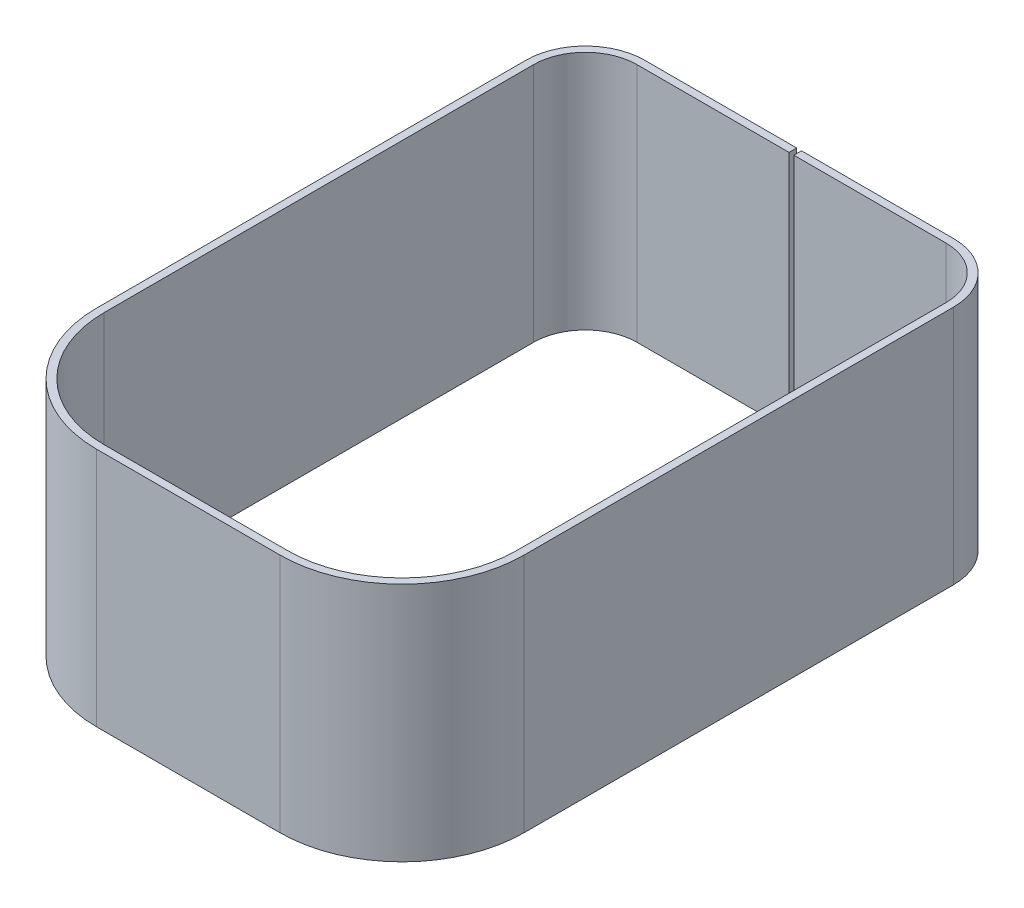
ISO-10303-21;
HEADER;
FILE_DESCRIPTION(('STEP AP214'),'2;1');
FILE_NAME('part.step','',(''),(''),'','','');
FILE_SCHEMA(('AUTOMOTIVE_DESIGN { 1 0 10303 214 1 1 1 1 }'));
ENDSEC;
DATA;
#1=APPLICATION_CONTEXT('core data for automotive mechanical design processes');
#2=APPLICATION_PROTOCOL_DEFINITION('international standard','automotive_design',2000,#1);
#3=PRODUCT_CONTEXT('',#1,'mechanical');
#4=PRODUCT('Part','Part','',(#3));
#5=PRODUCT_RELATED_PRODUCT_CATEGORY('part','',(#4));
#6=PRODUCT_DEFINITION_FORMATION('','',#4);
#7=PRODUCT_DEFINITION_CONTEXT('part definition',#1,'design');
#8=PRODUCT_DEFINITION('design','',#6,#7);
#9=PRODUCT_DEFINITION_SHAPE('','',#8);
#10=(LENGTH_UNIT() NAMED_UNIT(*) SI_UNIT(.MILLI.,.METRE.));
#11=(NAMED_UNIT(*) PLANE_ANGLE_UNIT() SI_UNIT($,.RADIAN.));
#12=(NAMED_UNIT(*) SI_UNIT($,.STERADIAN.) SOLID_ANGLE_UNIT());
#13=UNCERTAINTY_MEASURE_WITH_UNIT(LENGTH_MEASURE(1.E-05),#10,'distance_accuracy_value','');
#14=(GEOMETRIC_REPRESENTATION_CONTEXT(3) GLOBAL_UNCERTAINTY_ASSIGNED_CONTEXT((#13)) GLOBAL_UNIT_ASSIGNED_CONTEXT((#10,
#11,#12)) REPRESENTATION_CONTEXT('',''));
#15=CARTESIAN_POINT('',(0.,0.,0.));
#16=DIRECTION('',(0.,0.,1.));
#17=DIRECTION('',(1.,0.,0.));
#18=AXIS2_PLACEMENT_3D('',#15,#16,#17);
#19=CARTESIAN_POINT('',(32.1126094796714,30.,-61.9125));
#20=DIRECTION('',(0.,0.,-1.));
#21=DIRECTION('',(-1.,0.,0.));
#22=AXIS2_PLACEMENT_3D('',#19,#20,#21);
#23=PLANE('',#22);
#24=DIRECTION('',(0.,1.,0.));
#25=VECTOR('',#24,1.);
#26=CARTESIAN_POINT('',(0.5,30.,-61.9125));
#27=LINE('',#26,#25);
#28=CARTESIAN_POINT('',(0.5,-20.,-61.9125));
#29=VERTEX_POINT('',#28);
#30=CARTESIAN_POINT('',(0.5,30.,-61.9125));
#31=VERTEX_POINT('',#30);
#32=EDGE_CURVE('E11',#29,#31,#27,.T.);
#33=ORIENTED_EDGE('',*,*,#32,.F.);
#34=DIRECTION('',(1.,0.,0.));
#35=VECTOR('',#34,1.);
#36=CARTESIAN_POINT('',(32.1126094796714,-20.,-61.9125));
#37=LINE('',#36,#35);
#38=CARTESIAN_POINT('',(32.1126094796714,-20.,-61.9125));
#39=VERTEX_POINT('',#38);
#40=EDGE_CURVE('E140',#39,#29,#37,.F.);
#41=ORIENTED_EDGE('',*,*,#40,.F.);
#42=DIRECTION('',(0.,1.,0.));
#43=VECTOR('',#42,1.);
#44=CARTESIAN_POINT('',(32.1126094796714,30.,-61.9125));
#45=LINE('',#44,#43);
#46=CARTESIAN_POINT('',(32.1126094796714,30.,-61.9125));
#47=VERTEX_POINT('',#46);
#48=EDGE_CURVE('E47',#39,#47,#45,.T.);
#49=ORIENTED_EDGE('',*,*,#48,.T.);
#50=DIRECTION('',(-1.,0.,0.));
#51=VECTOR('',#50,1.);
#52=CARTESIAN_POINT('',(32.1126094796714,30.,-61.9125));
#53=LINE('',#52,#51);
#54=EDGE_CURVE('E250',#47,#31,#53,.T.);
#55=ORIENTED_EDGE('',*,*,#54,.T.);
#56=EDGE_LOOP('',(#33,#41,#49,#55));
#57=FACE_BOUND('',#56,.T.);
#58=ADVANCED_FACE('F37',(#57),#23,.F.);
#59=CARTESIAN_POINT('',(32.1126094796714,30.,-51.1626094796714));
#60=DIRECTION('',(0.,1.,0.));
#61=DIRECTION('',(0.,0.,1.));
#62=AXIS2_PLACEMENT_3D('',#59,#60,#61);
#63=CYLINDRICAL_SURFACE('',#62,10.7498905203286);
#64=ORIENTED_EDGE('',*,*,#48,.F.);
#65=CARTESIAN_POINT('',(32.1126094796714,-20.,-51.1626094796714));
#66=DIRECTION('',(0.,1.,0.));
#67=DIRECTION('',(0.,0.,1.));
#68=AXIS2_PLACEMENT_3D('',#65,#66,#67);
#69=CIRCLE('',#68,10.7498905203286);
#70=CARTESIAN_POINT('',(42.8625,-20.,-51.1626094796714));
#71=VERTEX_POINT('',#70);
#72=EDGE_CURVE('E195',#71,#39,#69,.T.);
#73=ORIENTED_EDGE('',*,*,#72,.F.);
#74=DIRECTION('',(0.,1.,0.));
#75=VECTOR('',#74,1.);
#76=CARTESIAN_POINT('',(42.8625,30.,-51.1626094796714));
#77=LINE('',#76,#75);
#78=CARTESIAN_POINT('',(42.8625,30.,-51.1626094796714));
#79=VERTEX_POINT('',#78);
#80=EDGE_CURVE('E243',#71,#79,#77,.T.);
#81=ORIENTED_EDGE('',*,*,#80,.T.);
#82=CARTESIAN_POINT('',(32.1126094796714,30.,-51.1626094796714));
#83=DIRECTION('',(0.,1.,0.));
#84=DIRECTION('',(1.,0.,0.));
#85=AXIS2_PLACEMENT_3D('',#82,#83,#84);
#86=CIRCLE('',#85,10.7498905203286);
#87=EDGE_CURVE('E260',#79,#47,#86,.T.);
#88=ORIENTED_EDGE('',*,*,#87,.T.);
#89=EDGE_LOOP('',(#64,#73,#81,#88));
#90=FACE_BOUND('',#89,.T.);
#91=ADVANCED_FACE('F263',(#90),#63,.F.);
#92=CARTESIAN_POINT('',(42.8625,30.,-51.1626094796714));
#93=DIRECTION('',(1.,0.,0.));
#94=DIRECTION('',(0.,0.,-1.));
#95=AXIS2_PLACEMENT_3D('',#92,#93,#94);
#96=PLANE('',#95);
#97=ORIENTED_EDGE('',*,*,#80,.F.);
#98=DIRECTION('',(0.,0.,-1.));
#99=VECTOR('',#98,1.);
#100=CARTESIAN_POINT('',(42.8625,-20.,-51.1626094796714));
#101=LINE('',#100,#99);
#102=CARTESIAN_POINT('',(42.8625,-20.,38.1));
#103=VERTEX_POINT('',#102);
#104=EDGE_CURVE('E192',#103,#71,#101,.T.);
#105=ORIENTED_EDGE('',*,*,#104,.F.);
#106=DIRECTION('',(0.,1.,0.));
#107=VECTOR('',#106,1.);
#108=CARTESIAN_POINT('',(42.8625,30.,38.1));
#109=LINE('',#108,#107);
#110=CARTESIAN_POINT('',(42.8625,30.,38.1));
#111=VERTEX_POINT('',#110);
#112=EDGE_CURVE('E240',#103,#111,#109,.T.);
#113=ORIENTED_EDGE('',*,*,#112,.T.);
#114=DIRECTION('',(0.,0.,-1.));
#115=VECTOR('',#114,1.);
#116=CARTESIAN_POINT('',(42.8625,30.,-51.1626094796714));
#117=LINE('',#116,#115);
#118=EDGE_CURVE('E264',#111,#79,#117,.T.);
#119=ORIENTED_EDGE('',*,*,#118,.T.);
#120=EDGE_LOOP('',(#97,#105,#113,#119));
#121=FACE_BOUND('',#120,.T.);
#122=ADVANCED_FACE('F360',(#121),#96,.F.);
#123=CARTESIAN_POINT('',(19.05,30.,38.1));
#124=DIRECTION('',(0.,1.,0.));
#125=DIRECTION('',(0.,0.,1.));
#126=AXIS2_PLACEMENT_3D('',#123,#124,#125);
#127=CYLINDRICAL_SURFACE('',#126,23.8125);
#128=ORIENTED_EDGE('',*,*,#112,.F.);
#129=CARTESIAN_POINT('',(19.05,-20.,38.1));
#130=DIRECTION('',(0.,1.,0.));
#131=DIRECTION('',(0.,0.,1.));
#132=AXIS2_PLACEMENT_3D('',#129,#130,#131);
#133=CIRCLE('',#132,23.8125);
#134=CARTESIAN_POINT('',(19.05,-20.,61.9125));
#135=VERTEX_POINT('',#134);
#136=EDGE_CURVE('E189',#135,#103,#133,.T.);
#137=ORIENTED_EDGE('',*,*,#136,.F.);
#138=DIRECTION('',(0.,1.,0.));
#139=VECTOR('',#138,1.);
#140=CARTESIAN_POINT('',(19.05,30.,61.9125));
#141=LINE('',#140,#139);
#142=CARTESIAN_POINT('',(19.05,30.,61.9125));
#143=VERTEX_POINT('',#142);
#144=EDGE_CURVE('E237',#135,#143,#141,.T.);
#145=ORIENTED_EDGE('',*,*,#144,.T.);
#146=CARTESIAN_POINT('',(19.05,30.,38.1));
#147=DIRECTION('',(0.,1.,0.));
#148=DIRECTION('',(1.,0.,0.));
#149=AXIS2_PLACEMENT_3D('',#146,#147,#148);
#150=CIRCLE('',#149,23.8125);
#151=EDGE_CURVE('E266',#143,#111,#150,.T.);
#152=ORIENTED_EDGE('',*,*,#151,.T.);
#153=EDGE_LOOP('',(#128,#137,#145,#152));
#154=FACE_BOUND('',#153,.T.);
#155=ADVANCED_FACE('F365',(#154),#127,.F.);
#156=CARTESIAN_POINT('',(-19.05,30.,61.9125));
#157=DIRECTION('',(0.,0.,1.));
#158=DIRECTION('',(1.,0.,0.));
#159=AXIS2_PLACEMENT_3D('',#156,#157,#158);
#160=PLANE('',#159);
#161=ORIENTED_EDGE('',*,*,#144,.F.);
#162=DIRECTION('',(1.,0.,0.));
#163=VECTOR('',#162,1.);
#164=CARTESIAN_POINT('',(32.1126094796714,-20.,61.9125));
#165=LINE('',#164,#163);
#166=CARTESIAN_POINT('',(-19.05,-20.,61.9125));
#167=VERTEX_POINT('',#166);
#168=EDGE_CURVE('E186',#167,#135,#165,.T.);
#169=ORIENTED_EDGE('',*,*,#168,.F.);
#170=DIRECTION('',(0.,1.,0.));
#171=VECTOR('',#170,1.);
#172=CARTESIAN_POINT('',(-19.05,30.,61.9125));
#173=LINE('',#172,#171);
#174=CARTESIAN_POINT('',(-19.05,30.,61.9125));
#175=VERTEX_POINT('',#174);
#176=EDGE_CURVE('E234',#167,#175,#173,.T.);
#177=ORIENTED_EDGE('',*,*,#176,.T.);
#178=DIRECTION('',(1.,0.,0.));
#179=VECTOR('',#178,1.);
#180=CARTESIAN_POINT('',(-19.05,30.,61.9125));
#181=LINE('',#180,#179);
#182=EDGE_CURVE('E272',#175,#143,#181,.T.);
#183=ORIENTED_EDGE('',*,*,#182,.T.);
#184=EDGE_LOOP('',(#161,#169,#177,#183));
#185=FACE_BOUND('',#184,.T.);
#186=ADVANCED_FACE('F368',(#185),#160,.F.);
#187=CARTESIAN_POINT('',(-19.05,30.,38.1));
#188=DIRECTION('',(0.,1.,0.));
#189=DIRECTION('',(0.,0.,1.));
#190=AXIS2_PLACEMENT_3D('',#187,#188,#189);
#191=CYLINDRICAL_SURFACE('',#190,23.8125);
#192=ORIENTED_EDGE('',*,*,#176,.F.);
#193=CARTESIAN_POINT('',(-19.05,-20.,38.1));
#194=DIRECTION('',(0.,1.,0.));
#195=DIRECTION('',(0.,0.,1.));
#196=AXIS2_PLACEMENT_3D('',#193,#194,#195);
#197=CIRCLE('',#196,23.8125);
#198=CARTESIAN_POINT('',(-42.8625,-20.,38.1));
#199=VERTEX_POINT('',#198);
#200=EDGE_CURVE('E183',#199,#167,#197,.T.);
#201=ORIENTED_EDGE('',*,*,#200,.F.);
#202=DIRECTION('',(0.,1.,0.));
#203=VECTOR('',#202,1.);
#204=CARTESIAN_POINT('',(-42.8625,30.,38.1));
#205=LINE('',#204,#203);
#206=CARTESIAN_POINT('',(-42.8625,30.,38.1));
#207=VERTEX_POINT('',#206);
#208=EDGE_CURVE('E231',#199,#207,#205,.T.);
#209=ORIENTED_EDGE('',*,*,#208,.T.);
#210=CARTESIAN_POINT('',(-19.05,30.,38.1));
#211=DIRECTION('',(0.,1.,0.));
#212=DIRECTION('',(1.,0.,0.));
#213=AXIS2_PLACEMENT_3D('',#210,#211,#212);
#214=CIRCLE('',#213,23.8125);
#215=EDGE_CURVE('E275',#207,#175,#214,.T.);
#216=ORIENTED_EDGE('',*,*,#215,.T.);
#217=EDGE_LOOP('',(#192,#201,#209,#216));
#218=FACE_BOUND('',#217,.T.);
#219=ADVANCED_FACE('F372',(#218),#191,.F.);
#220=CARTESIAN_POINT('',(-42.8625,30.,-51.1626094796714));
#221=DIRECTION('',(-1.,0.,0.));
#222=DIRECTION('',(0.,0.,1.));
#223=AXIS2_PLACEMENT_3D('',#220,#221,#222);
#224=PLANE('',#223);
#225=ORIENTED_EDGE('',*,*,#208,.F.);
#226=DIRECTION('',(0.,0.,-1.));
#227=VECTOR('',#226,1.);
#228=CARTESIAN_POINT('',(-42.8625,-20.,-51.1626094796714));
#229=LINE('',#228,#227);
#230=CARTESIAN_POINT('',(-42.8625,-20.,-51.1626094796714));
#231=VERTEX_POINT('',#230);
#232=EDGE_CURVE('E180',#231,#199,#229,.F.);
#233=ORIENTED_EDGE('',*,*,#232,.F.);
#234=DIRECTION('',(0.,1.,0.));
#235=VECTOR('',#234,1.);
#236=CARTESIAN_POINT('',(-42.8625,30.,-51.1626094796714));
#237=LINE('',#236,#235);
#238=CARTESIAN_POINT('',(-42.8625,30.,-51.1626094796714));
#239=VERTEX_POINT('',#238);
#240=EDGE_CURVE('E228',#231,#239,#237,.T.);
#241=ORIENTED_EDGE('',*,*,#240,.T.);
#242=DIRECTION('',(0.,0.,1.));
#243=VECTOR('',#242,1.);
#244=CARTESIAN_POINT('',(-42.8625,30.,-51.1626094796714));
#245=LINE('',#244,#243);
#246=EDGE_CURVE('E278',#239,#207,#245,.T.);
#247=ORIENTED_EDGE('',*,*,#246,.T.);
#248=EDGE_LOOP('',(#225,#233,#241,#247));
#249=FACE_BOUND('',#248,.T.);
#250=ADVANCED_FACE('F377',(#249),#224,.F.);
#251=CARTESIAN_POINT('',(-32.1126094796714,30.,-51.1626094796714));
#252=DIRECTION('',(0.,1.,0.));
#253=DIRECTION('',(0.,0.,1.));
#254=AXIS2_PLACEMENT_3D('',#251,#252,#253);
#255=CYLINDRICAL_SURFACE('',#254,10.7498905203286);
#256=ORIENTED_EDGE('',*,*,#240,.F.);
#257=CARTESIAN_POINT('',(-32.1126094796714,-20.,-51.1626094796714));
#258=DIRECTION('',(0.,1.,0.));
#259=DIRECTION('',(0.,0.,1.));
#260=AXIS2_PLACEMENT_3D('',#257,#258,#259);
#261=CIRCLE('',#260,10.7498905203286);
#262=CARTESIAN_POINT('',(-32.1126094796714,-20.,-61.9125));
#263=VERTEX_POINT('',#262);
#264=EDGE_CURVE('E177',#263,#231,#261,.T.);
#265=ORIENTED_EDGE('',*,*,#264,.F.);
#266=DIRECTION('',(0.,1.,0.));
#267=VECTOR('',#266,1.);
#268=CARTESIAN_POINT('',(-32.1126094796714,30.,-61.9125));
#269=LINE('',#268,#267);
#270=CARTESIAN_POINT('',(-32.1126094796714,30.,-61.9125));
#271=VERTEX_POINT('',#270);
#272=EDGE_CURVE('E225',#263,#271,#269,.T.);
#273=ORIENTED_EDGE('',*,*,#272,.T.);
#274=CARTESIAN_POINT('',(-32.1126094796714,30.,-51.1626094796714));
#275=DIRECTION('',(0.,1.,0.));
#276=DIRECTION('',(1.,0.,0.));
#277=AXIS2_PLACEMENT_3D('',#274,#275,#276);
#278=CIRCLE('',#277,10.7498905203286);
#279=EDGE_CURVE('E281',#271,#239,#278,.T.);
#280=ORIENTED_EDGE('',*,*,#279,.T.);
#281=EDGE_LOOP('',(#256,#265,#273,#280));
#282=FACE_BOUND('',#281,.T.);
#283=ADVANCED_FACE('F380',(#282),#255,.F.);
#284=CARTESIAN_POINT('',(-32.1126094796714,30.,-61.9125));
#285=DIRECTION('',(0.,0.,-1.));
#286=DIRECTION('',(-1.,0.,0.));
#287=AXIS2_PLACEMENT_3D('',#284,#285,#286);
#288=PLANE('',#287);
#289=ORIENTED_EDGE('',*,*,#272,.F.);
#290=DIRECTION('',(1.,0.,0.));
#291=VECTOR('',#290,1.);
#292=CARTESIAN_POINT('',(32.1126094796714,-20.,-61.9125));
#293=LINE('',#292,#291);
#294=CARTESIAN_POINT('',(-0.5,-20.,-61.9125));
#295=VERTEX_POINT('',#294);
#296=EDGE_CURVE('E174',#295,#263,#293,.F.);
#297=ORIENTED_EDGE('',*,*,#296,.F.);
#298=DIRECTION('',(0.,1.,0.));
#299=VECTOR('',#298,1.);
#300=CARTESIAN_POINT('',(-0.5,30.,-61.9125));
#301=LINE('',#300,#299);
#302=CARTESIAN_POINT('',(-0.5,30.,-61.9125));
#303=VERTEX_POINT('',#302);
#304=EDGE_CURVE('E222',#295,#303,#301,.T.);
#305=ORIENTED_EDGE('',*,*,#304,.T.);
#306=DIRECTION('',(-1.,0.,0.));
#307=VECTOR('',#306,1.);
#308=CARTESIAN_POINT('',(-32.1126094796714,30.,-61.9125));
#309=LINE('',#308,#307);
#310=EDGE_CURVE('E284',#303,#271,#309,.T.);
#311=ORIENTED_EDGE('',*,*,#310,.T.);
#312=EDGE_LOOP('',(#289,#297,#305,#311));
#313=FACE_BOUND('',#312,.T.);
#314=ADVANCED_FACE('F385',(#313),#288,.F.);
#315=CARTESIAN_POINT('',(-0.5,30.,-63.5));
#316=DIRECTION('',(-1.,0.,0.));
#317=DIRECTION('',(0.,0.,1.));
#318=AXIS2_PLACEMENT_3D('',#315,#316,#317);
#319=PLANE('',#318);
#320=ORIENTED_EDGE('',*,*,#304,.F.);
#321=DIRECTION('',(0.,0.,-1.));
#322=VECTOR('',#321,1.);
#323=CARTESIAN_POINT('',(-0.5,-20.,-51.1626094796714));
#324=LINE('',#323,#322);
#325=CARTESIAN_POINT('',(-0.5,-20.,-63.5));
#326=VERTEX_POINT('',#325);
#327=EDGE_CURVE('E171',#326,#295,#324,.F.);
#328=ORIENTED_EDGE('',*,*,#327,.F.);
#329=DIRECTION('',(0.,1.,0.));
#330=VECTOR('',#329,1.);
#331=CARTESIAN_POINT('',(-0.5,30.,-63.5));
#332=LINE('',#331,#330);
#333=CARTESIAN_POINT('',(-0.5,30.,-63.5));
#334=VERTEX_POINT('',#333);
#335=EDGE_CURVE('E219',#326,#334,#332,.T.);
#336=ORIENTED_EDGE('',*,*,#335,.T.);
#337=DIRECTION('',(0.,0.,1.));
#338=VECTOR('',#337,1.);
#339=CARTESIAN_POINT('',(-0.5,30.,-63.5));
#340=LINE('',#339,#338);
#341=EDGE_CURVE('E287',#334,#303,#340,.T.);
#342=ORIENTED_EDGE('',*,*,#341,.T.);
#343=EDGE_LOOP('',(#320,#328,#336,#342));
#344=FACE_BOUND('',#343,.T.);
#345=ADVANCED_FACE('F390',(#344),#319,.F.);
#346=CARTESIAN_POINT('',(-32.1126094796714,30.,-63.5));
#347=DIRECTION('',(0.,0.,-1.));
#348=DIRECTION('',(-1.,0.,0.));
#349=AXIS2_PLACEMENT_3D('',#346,#347,#348);
#350=PLANE('',#349);
#351=ORIENTED_EDGE('',*,*,#335,.F.);
#352=DIRECTION('',(1.,0.,0.));
#353=VECTOR('',#352,1.);
#354=CARTESIAN_POINT('',(32.1126094796714,-20.,-63.5));
#355=LINE('',#354,#353);
#356=CARTESIAN_POINT('',(-32.1126094796714,-20.,-63.5));
#357=VERTEX_POINT('',#356);
#358=EDGE_CURVE('E168',#326,#357,#355,.F.);
#359=ORIENTED_EDGE('',*,*,#358,.T.);
#360=DIRECTION('',(0.,1.,0.));
#361=VECTOR('',#360,1.);
#362=CARTESIAN_POINT('',(-32.1126094796714,30.,-63.5));
#363=LINE('',#362,#361);
#364=CARTESIAN_POINT('',(-32.1126094796714,30.,-63.5));
#365=VERTEX_POINT('',#364);
#366=EDGE_CURVE('E216',#357,#365,#363,.T.);
#367=ORIENTED_EDGE('',*,*,#366,.T.);
#368=DIRECTION('',(-1.,0.,0.));
#369=VECTOR('',#368,1.);
#370=CARTESIAN_POINT('',(-32.1126094796714,30.,-63.5));
#371=LINE('',#370,#369);
#372=EDGE_CURVE('E290',#334,#365,#371,.T.);
#373=ORIENTED_EDGE('',*,*,#372,.F.);
#374=EDGE_LOOP('',(#351,#359,#367,#373));
#375=FACE_BOUND('',#374,.T.);
#376=ADVANCED_FACE('F392',(#375),#350,.T.);
#377=CARTESIAN_POINT('',(-32.1126094796714,30.,-51.1626094796714));
#378=DIRECTION('',(0.,1.,0.));
#379=DIRECTION('',(0.,0.,1.));
#380=AXIS2_PLACEMENT_3D('',#377,#378,#379);
#381=CYLINDRICAL_SURFACE('',#380,12.3373905203286);
#382=ORIENTED_EDGE('',*,*,#366,.F.);
#383=CARTESIAN_POINT('',(-32.1126094796714,-20.,-51.1626094796714));
#384=DIRECTION('',(0.,1.,0.));
#385=DIRECTION('',(0.,0.,1.));
#386=AXIS2_PLACEMENT_3D('',#383,#384,#385);
#387=CIRCLE('',#386,12.3373905203286);
#388=CARTESIAN_POINT('',(-44.45,-20.,-51.1626094796714));
#389=VERTEX_POINT('',#388);
#390=EDGE_CURVE('E165',#357,#389,#387,.T.);
#391=ORIENTED_EDGE('',*,*,#390,.T.);
#392=DIRECTION('',(0.,1.,0.));
#393=VECTOR('',#392,1.);
#394=CARTESIAN_POINT('',(-44.45,30.,-51.1626094796714));
#395=LINE('',#394,#393);
#396=CARTESIAN_POINT('',(-44.45,30.,-51.1626094796714));
#397=VERTEX_POINT('',#396);
#398=EDGE_CURVE('E213',#389,#397,#395,.T.);
#399=ORIENTED_EDGE('',*,*,#398,.T.);
#400=CARTESIAN_POINT('',(-32.1126094796714,30.,-51.1626094796714));
#401=DIRECTION('',(0.,1.,0.));
#402=DIRECTION('',(0.,0.,1.));
#403=AXIS2_PLACEMENT_3D('',#400,#401,#402);
#404=CIRCLE('',#403,12.3373905203286);
#405=EDGE_CURVE('E293',#365,#397,#404,.T.);
#406=ORIENTED_EDGE('',*,*,#405,.F.);
#407=EDGE_LOOP('',(#382,#391,#399,#406));
#408=FACE_BOUND('',#407,.T.);
#409=ADVANCED_FACE('F396',(#408),#381,.T.);
#410=CARTESIAN_POINT('',(-44.45,30.,-51.1626094796714));
#411=DIRECTION('',(-1.,0.,0.));
#412=DIRECTION('',(0.,0.,1.));
#413=AXIS2_PLACEMENT_3D('',#410,#411,#412);
#414=PLANE('',#413);
#415=ORIENTED_EDGE('',*,*,#398,.F.);
#416=DIRECTION('',(0.,0.,-1.));
#417=VECTOR('',#416,1.);
#418=CARTESIAN_POINT('',(-44.45,-20.,-51.1626094796714));
#419=LINE('',#418,#417);
#420=CARTESIAN_POINT('',(-44.45,-20.,38.1));
#421=VERTEX_POINT('',#420);
#422=EDGE_CURVE('E162',#389,#421,#419,.F.);
#423=ORIENTED_EDGE('',*,*,#422,.T.);
#424=DIRECTION('',(0.,1.,0.));
#425=VECTOR('',#424,1.);
#426=CARTESIAN_POINT('',(-44.45,30.,38.1));
#427=LINE('',#426,#425);
#428=CARTESIAN_POINT('',(-44.45,30.,38.1));
#429=VERTEX_POINT('',#428);
#430=EDGE_CURVE('E210',#421,#429,#427,.T.);
#431=ORIENTED_EDGE('',*,*,#430,.T.);
#432=DIRECTION('',(0.,0.,1.));
#433=VECTOR('',#432,1.);
#434=CARTESIAN_POINT('',(-44.45,30.,-51.1626094796714));
#435=LINE('',#434,#433);
#436=EDGE_CURVE('E296',#397,#429,#435,.T.);
#437=ORIENTED_EDGE('',*,*,#436,.F.);
#438=EDGE_LOOP('',(#415,#423,#431,#437));
#439=FACE_BOUND('',#438,.T.);
#440=ADVANCED_FACE('F398',(#439),#414,.T.);
#441=CARTESIAN_POINT('',(-19.05,30.,38.1));
#442=DIRECTION('',(0.,1.,0.));
#443=DIRECTION('',(0.,0.,1.));
#444=AXIS2_PLACEMENT_3D('',#441,#442,#443);
#445=CYLINDRICAL_SURFACE('',#444,25.4);
#446=ORIENTED_EDGE('',*,*,#430,.F.);
#447=CARTESIAN_POINT('',(-19.05,-20.,38.1));
#448=DIRECTION('',(0.,1.,0.));
#449=DIRECTION('',(0.,0.,1.));
#450=AXIS2_PLACEMENT_3D('',#447,#448,#449);
#451=CIRCLE('',#450,25.4);
#452=CARTESIAN_POINT('',(-19.05,-20.,63.5));
#453=VERTEX_POINT('',#452);
#454=EDGE_CURVE('E159',#421,#453,#451,.T.);
#455=ORIENTED_EDGE('',*,*,#454,.T.);
#456=DIRECTION('',(0.,1.,0.));
#457=VECTOR('',#456,1.);
#458=CARTESIAN_POINT('',(-19.05,30.,63.5));
#459=LINE('',#458,#457);
#460=CARTESIAN_POINT('',(-19.05,30.,63.5));
#461=VERTEX_POINT('',#460);
#462=EDGE_CURVE('E207',#453,#461,#459,.T.);
#463=ORIENTED_EDGE('',*,*,#462,.T.);
#464=CARTESIAN_POINT('',(-19.05,30.,38.1));
#465=DIRECTION('',(0.,1.,0.));
#466=DIRECTION('',(0.,0.,1.));
#467=AXIS2_PLACEMENT_3D('',#464,#465,#466);
#468=CIRCLE('',#467,25.4);
#469=EDGE_CURVE('E299',#429,#461,#468,.T.);
#470=ORIENTED_EDGE('',*,*,#469,.F.);
#471=EDGE_LOOP('',(#446,#455,#463,#470));
#472=FACE_BOUND('',#471,.T.);
#473=ADVANCED_FACE('F331',(#472),#445,.T.);
#474=CARTESIAN_POINT('',(-19.05,30.,63.5));
#475=DIRECTION('',(0.,0.,1.));
#476=DIRECTION('',(1.,0.,0.));
#477=AXIS2_PLACEMENT_3D('',#474,#475,#476);
#478=PLANE('',#477);
#479=ORIENTED_EDGE('',*,*,#462,.F.);
#480=DIRECTION('',(1.,0.,0.));
#481=VECTOR('',#480,1.);
#482=CARTESIAN_POINT('',(32.1126094796714,-20.,63.5));
#483=LINE('',#482,#481);
#484=CARTESIAN_POINT('',(19.05,-20.,63.5));
#485=VERTEX_POINT('',#484);
#486=EDGE_CURVE('E156',#453,#485,#483,.T.);
#487=ORIENTED_EDGE('',*,*,#486,.T.);
#488=DIRECTION('',(0.,1.,0.));
#489=VECTOR('',#488,1.);
#490=CARTESIAN_POINT('',(19.05,30.,63.5));
#491=LINE('',#490,#489);
#492=CARTESIAN_POINT('',(19.05,30.,63.5));
#493=VERTEX_POINT('',#492);
#494=EDGE_CURVE('E204',#485,#493,#491,.T.);
#495=ORIENTED_EDGE('',*,*,#494,.T.);
#496=DIRECTION('',(1.,0.,0.));
#497=VECTOR('',#496,1.);
#498=CARTESIAN_POINT('',(-19.05,30.,63.5));
#499=LINE('',#498,#497);
#500=EDGE_CURVE('E302',#461,#493,#499,.T.);
#501=ORIENTED_EDGE('',*,*,#500,.F.);
#502=EDGE_LOOP('',(#479,#487,#495,#501));
#503=FACE_BOUND('',#502,.T.);
#504=ADVANCED_FACE('F323',(#503),#478,.T.);
#505=CARTESIAN_POINT('',(19.05,30.,38.1));
#506=DIRECTION('',(0.,1.,0.));
#507=DIRECTION('',(0.,0.,1.));
#508=AXIS2_PLACEMENT_3D('',#505,#506,#507);
#509=CYLINDRICAL_SURFACE('',#508,25.4);
#510=ORIENTED_EDGE('',*,*,#494,.F.);
#511=CARTESIAN_POINT('',(19.05,-20.,38.1));
#512=DIRECTION('',(0.,1.,0.));
#513=DIRECTION('',(0.,0.,1.));
#514=AXIS2_PLACEMENT_3D('',#511,#512,#513);
#515=CIRCLE('',#514,25.4);
#516=CARTESIAN_POINT('',(44.45,-20.,38.1));
#517=VERTEX_POINT('',#516);
#518=EDGE_CURVE('E153',#485,#517,#515,.T.);
#519=ORIENTED_EDGE('',*,*,#518,.T.);
#520=DIRECTION('',(0.,1.,0.));
#521=VECTOR('',#520,1.);
#522=CARTESIAN_POINT('',(44.45,30.,38.1));
#523=LINE('',#522,#521);
#524=CARTESIAN_POINT('',(44.45,30.,38.1));
#525=VERTEX_POINT('',#524);
#526=EDGE_CURVE('E201',#517,#525,#523,.T.);
#527=ORIENTED_EDGE('',*,*,#526,.T.);
#528=CARTESIAN_POINT('',(19.05,30.,38.1));
#529=DIRECTION('',(0.,1.,0.));
#530=DIRECTION('',(0.,0.,1.));
#531=AXIS2_PLACEMENT_3D('',#528,#529,#530);
#532=CIRCLE('',#531,25.4);
#533=EDGE_CURVE('E305',#493,#525,#532,.T.);
#534=ORIENTED_EDGE('',*,*,#533,.F.);
#535=EDGE_LOOP('',(#510,#519,#527,#534));
#536=FACE_BOUND('',#535,.T.);
#537=ADVANCED_FACE('F318',(#536),#509,.T.);
#538=CARTESIAN_POINT('',(44.45,30.,-51.1626094796714));
#539=DIRECTION('',(1.,0.,0.));
#540=DIRECTION('',(0.,0.,-1.));
#541=AXIS2_PLACEMENT_3D('',#538,#539,#540);
#542=PLANE('',#541);
#543=ORIENTED_EDGE('',*,*,#526,.F.);
#544=DIRECTION('',(0.,0.,-1.));
#545=VECTOR('',#544,1.);
#546=CARTESIAN_POINT('',(44.45,-20.,-51.1626094796714));
#547=LINE('',#546,#545);
#548=CARTESIAN_POINT('',(44.45,-20.,-51.1626094796714));
#549=VERTEX_POINT('',#548);
#550=EDGE_CURVE('E150',#517,#549,#547,.T.);
#551=ORIENTED_EDGE('',*,*,#550,.T.);
#552=DIRECTION('',(0.,1.,0.));
#553=VECTOR('',#552,1.);
#554=CARTESIAN_POINT('',(44.45,30.,-51.1626094796714));
#555=LINE('',#554,#553);
#556=CARTESIAN_POINT('',(44.45,30.,-51.1626094796714));
#557=VERTEX_POINT('',#556);
#558=EDGE_CURVE('E199',#549,#557,#555,.T.);
#559=ORIENTED_EDGE('',*,*,#558,.T.);
#560=DIRECTION('',(0.,0.,-1.));
#561=VECTOR('',#560,1.);
#562=CARTESIAN_POINT('',(44.45,30.,-51.1626094796714));
#563=LINE('',#562,#561);
#564=EDGE_CURVE('E307',#525,#557,#563,.T.);
#565=ORIENTED_EDGE('',*,*,#564,.F.);
#566=EDGE_LOOP('',(#543,#551,#559,#565));
#567=FACE_BOUND('',#566,.T.);
#568=ADVANCED_FACE('F314',(#567),#542,.T.);
#569=CARTESIAN_POINT('',(32.1126094796714,30.,-51.1626094796714));
#570=DIRECTION('',(0.,1.,0.));
#571=DIRECTION('',(0.,0.,1.));
#572=AXIS2_PLACEMENT_3D('',#569,#570,#571);
#573=CYLINDRICAL_SURFACE('',#572,12.3373905203286);
#574=ORIENTED_EDGE('',*,*,#558,.F.);
#575=CARTESIAN_POINT('',(32.1126094796714,-20.,-51.1626094796714));
#576=DIRECTION('',(0.,1.,0.));
#577=DIRECTION('',(0.,0.,1.));
#578=AXIS2_PLACEMENT_3D('',#575,#576,#577);
#579=CIRCLE('',#578,12.3373905203286);
#580=CARTESIAN_POINT('',(32.1126094796714,-20.,-63.5));
#581=VERTEX_POINT('',#580);
#582=EDGE_CURVE('E147',#549,#581,#579,.T.);
#583=ORIENTED_EDGE('',*,*,#582,.T.);
#584=DIRECTION('',(0.,1.,0.));
#585=VECTOR('',#584,1.);
#586=CARTESIAN_POINT('',(32.1126094796714,30.,-63.5));
#587=LINE('',#586,#585);
#588=CARTESIAN_POINT('',(32.1126094796714,30.,-63.5));
#589=VERTEX_POINT('',#588);
#590=EDGE_CURVE('E55',#581,#589,#587,.T.);
#591=ORIENTED_EDGE('',*,*,#590,.T.);
#592=CARTESIAN_POINT('',(32.1126094796714,30.,-51.1626094796714));
#593=DIRECTION('',(0.,1.,0.));
#594=DIRECTION('',(0.,0.,1.));
#595=AXIS2_PLACEMENT_3D('',#592,#593,#594);
#596=CIRCLE('',#595,12.3373905203286);
#597=EDGE_CURVE('E133',#557,#589,#596,.T.);
#598=ORIENTED_EDGE('',*,*,#597,.F.);
#599=EDGE_LOOP('',(#574,#583,#591,#598));
#600=FACE_BOUND('',#599,.T.);
#601=ADVANCED_FACE('F311',(#600),#573,.T.);
#602=CARTESIAN_POINT('',(32.1126094796714,30.,-63.5));
#603=DIRECTION('',(0.,0.,-1.));
#604=DIRECTION('',(-1.,0.,0.));
#605=AXIS2_PLACEMENT_3D('',#602,#603,#604);
#606=PLANE('',#605);
#607=ORIENTED_EDGE('',*,*,#590,.F.);
#608=DIRECTION('',(1.,0.,0.));
#609=VECTOR('',#608,1.);
#610=CARTESIAN_POINT('',(32.1126094796714,-20.,-63.5));
#611=LINE('',#610,#609);
#612=CARTESIAN_POINT('',(0.5,-20.,-63.5));
#613=VERTEX_POINT('',#612);
#614=EDGE_CURVE('E138',#581,#613,#611,.F.);
#615=ORIENTED_EDGE('',*,*,#614,.T.);
#616=DIRECTION('',(0.,1.,0.));
#617=VECTOR('',#616,1.);
#618=CARTESIAN_POINT('',(0.5,30.,-63.5));
#619=LINE('',#618,#617);
#620=CARTESIAN_POINT('',(0.5,30.,-63.5));
#621=VERTEX_POINT('',#620);
#622=EDGE_CURVE('E41',#613,#621,#619,.T.);
#623=ORIENTED_EDGE('',*,*,#622,.T.);
#624=DIRECTION('',(-1.,0.,0.));
#625=VECTOR('',#624,1.);
#626=CARTESIAN_POINT('',(32.1126094796714,30.,-63.5));
#627=LINE('',#626,#625);
#628=EDGE_CURVE('E149',#589,#621,#627,.T.);
#629=ORIENTED_EDGE('',*,*,#628,.F.);
#630=EDGE_LOOP('',(#607,#615,#623,#629));
#631=FACE_BOUND('',#630,.T.);
#632=ADVANCED_FACE('F142',(#631),#606,.T.);
#633=CARTESIAN_POINT('',(0.5,30.,-61.9125));
#634=DIRECTION('',(1.,0.,0.));
#635=DIRECTION('',(0.,0.,-1.));
#636=AXIS2_PLACEMENT_3D('',#633,#634,#635);
#637=PLANE('',#636);
#638=DIRECTION('',(0.,0.,-1.));
#639=VECTOR('',#638,1.);
#640=CARTESIAN_POINT('',(0.5,-20.,-51.1626094796714));
#641=LINE('',#640,#639);
#642=EDGE_CURVE('E127',#29,#613,#641,.T.);
#643=ORIENTED_EDGE('',*,*,#642,.F.);
#644=ORIENTED_EDGE('',*,*,#32,.T.);
#645=DIRECTION('',(0.,0.,-1.));
#646=VECTOR('',#645,1.);
#647=CARTESIAN_POINT('',(0.5,30.,-61.9125));
#648=LINE('',#647,#646);
#649=EDGE_CURVE('E129',#31,#621,#648,.T.);
#650=ORIENTED_EDGE('',*,*,#649,.T.);
#651=ORIENTED_EDGE('',*,*,#622,.F.);
#652=EDGE_LOOP('',(#643,#644,#650,#651));
#653=FACE_BOUND('',#652,.T.);
#654=ADVANCED_FACE('F39',(#653),#637,.F.);
#655=CARTESIAN_POINT('',(32.1126094796714,30.,-51.1626094796714));
#656=DIRECTION('',(0.,1.,0.));
#657=DIRECTION('',(1.,0.,0.));
#658=AXIS2_PLACEMENT_3D('',#655,#656,#657);
#659=PLANE('',#658);
#660=ORIENTED_EDGE('',*,*,#628,.T.);
#661=ORIENTED_EDGE('',*,*,#649,.F.);
#662=ORIENTED_EDGE('',*,*,#54,.F.);
#663=ORIENTED_EDGE('',*,*,#87,.F.);
#664=ORIENTED_EDGE('',*,*,#118,.F.);
#665=ORIENTED_EDGE('',*,*,#151,.F.);
#666=ORIENTED_EDGE('',*,*,#182,.F.);
#667=ORIENTED_EDGE('',*,*,#215,.F.);
#668=ORIENTED_EDGE('',*,*,#246,.F.);
#669=ORIENTED_EDGE('',*,*,#279,.F.);
#670=ORIENTED_EDGE('',*,*,#310,.F.);
#671=ORIENTED_EDGE('',*,*,#341,.F.);
#672=ORIENTED_EDGE('',*,*,#372,.T.);
#673=ORIENTED_EDGE('',*,*,#405,.T.);
#674=ORIENTED_EDGE('',*,*,#436,.T.);
#675=ORIENTED_EDGE('',*,*,#469,.T.);
#676=ORIENTED_EDGE('',*,*,#500,.T.);
#677=ORIENTED_EDGE('',*,*,#533,.T.);
#678=ORIENTED_EDGE('',*,*,#564,.T.);
#679=ORIENTED_EDGE('',*,*,#597,.T.);
#680=EDGE_LOOP('',(#660,#661,#662,#663,#664,#665,#666,#667,#668,#669,#670,#671,#672,#673,#674,
#675,#676,#677,#678,#679));
#681=FACE_BOUND('',#680,.T.);
#682=ADVANCED_FACE('F258',(#681),#659,.T.);
#683=CARTESIAN_POINT('',(32.1126094796714,-20.,-51.1626094796714));
#684=DIRECTION('',(0.,1.,0.));
#685=DIRECTION('',(1.,0.,0.));
#686=AXIS2_PLACEMENT_3D('',#683,#684,#685);
#687=PLANE('',#686);
#688=ORIENTED_EDGE('',*,*,#614,.F.);
#689=ORIENTED_EDGE('',*,*,#582,.F.);
#690=ORIENTED_EDGE('',*,*,#550,.F.);
#691=ORIENTED_EDGE('',*,*,#518,.F.);
#692=ORIENTED_EDGE('',*,*,#486,.F.);
#693=ORIENTED_EDGE('',*,*,#454,.F.);
#694=ORIENTED_EDGE('',*,*,#422,.F.);
#695=ORIENTED_EDGE('',*,*,#390,.F.);
#696=ORIENTED_EDGE('',*,*,#358,.F.);
#697=ORIENTED_EDGE('',*,*,#327,.T.);
#698=ORIENTED_EDGE('',*,*,#296,.T.);
#699=ORIENTED_EDGE('',*,*,#264,.T.);
#700=ORIENTED_EDGE('',*,*,#232,.T.);
#701=ORIENTED_EDGE('',*,*,#200,.T.);
#702=ORIENTED_EDGE('',*,*,#168,.T.);
#703=ORIENTED_EDGE('',*,*,#136,.T.);
#704=ORIENTED_EDGE('',*,*,#104,.T.);
#705=ORIENTED_EDGE('',*,*,#72,.T.);
#706=ORIENTED_EDGE('',*,*,#40,.T.);
#707=ORIENTED_EDGE('',*,*,#642,.T.);
#708=EDGE_LOOP('',(#688,#689,#690,#691,#692,#693,#694,#695,#696,#697,#698,#699,#700,#701,#702,
#703,#704,#705,#706,#707));
#709=FACE_BOUND('',#708,.T.);
#710=ADVANCED_FACE('F136',(#709),#687,.F.);
#711=CLOSED_SHELL('',(#58,#91,#122,#155,#186,#219,#250,#283,#314,#345,#376,#409,#440,#473,#504,
#537,#568,#601,#632,#654,#682,#710));
#712=MANIFOLD_SOLID_BREP('B2',#711);
#713=ADVANCED_BREP_SHAPE_REPRESENTATION('',(#18,#712),#14);
#714=SHAPE_DEFINITION_REPRESENTATION(#9,#713);
ENDSEC;
END-ISO-10303-21;
